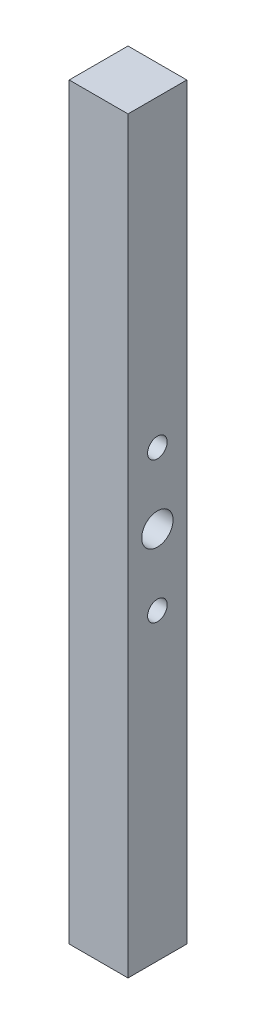
ISO-10303-21;
HEADER;
FILE_DESCRIPTION(('STEP AP214'),'2;1');
FILE_NAME('part.step','',(''),(''),'','','');
FILE_SCHEMA(('AUTOMOTIVE_DESIGN { 1 0 10303 214 1 1 1 1 }'));
ENDSEC;
DATA;
#1=APPLICATION_CONTEXT('core data for automotive mechanical design processes');
#2=APPLICATION_PROTOCOL_DEFINITION('international standard','automotive_design',2000,#1);
#3=PRODUCT_CONTEXT('',#1,'mechanical');
#4=PRODUCT('Part','Part','',(#3));
#5=PRODUCT_RELATED_PRODUCT_CATEGORY('part','',(#4));
#6=PRODUCT_DEFINITION_FORMATION('','',#4);
#7=PRODUCT_DEFINITION_CONTEXT('part definition',#1,'design');
#8=PRODUCT_DEFINITION('design','',#6,#7);
#9=PRODUCT_DEFINITION_SHAPE('','',#8);
#10=(LENGTH_UNIT() NAMED_UNIT(*) SI_UNIT(.MILLI.,.METRE.));
#11=(NAMED_UNIT(*) PLANE_ANGLE_UNIT() SI_UNIT($,.RADIAN.));
#12=(NAMED_UNIT(*) SI_UNIT($,.STERADIAN.) SOLID_ANGLE_UNIT());
#13=UNCERTAINTY_MEASURE_WITH_UNIT(LENGTH_MEASURE(1.E-05),#10,'distance_accuracy_value','');
#14=(GEOMETRIC_REPRESENTATION_CONTEXT(3) GLOBAL_UNCERTAINTY_ASSIGNED_CONTEXT((#13)) GLOBAL_UNIT_ASSIGNED_CONTEXT((#10,
#11,#12)) REPRESENTATION_CONTEXT('',''));
#15=CARTESIAN_POINT('',(0.,0.,0.));
#16=DIRECTION('',(0.,0.,1.));
#17=DIRECTION('',(1.,0.,0.));
#18=AXIS2_PLACEMENT_3D('',#15,#16,#17);
#19=CARTESIAN_POINT('',(7.5,190.88,-7.5));
#20=DIRECTION('',(-1.,0.,0.));
#21=DIRECTION('',(0.,0.,1.));
#22=AXIS2_PLACEMENT_3D('',#19,#20,#21);
#23=PLANE('',#22);
#24=CARTESIAN_POINT('',(7.5,77.44,0.));
#25=DIRECTION('',(1.,0.,0.));
#26=DIRECTION('',(0.,0.,-1.));
#27=AXIS2_PLACEMENT_3D('',#24,#25,#26);
#28=CIRCLE('',#27,2.5);
#29=CARTESIAN_POINT('',(7.5,77.44,-2.49999999999999));
#30=VERTEX_POINT('',#29);
#31=EDGE_CURVE('E136',#30,#30,#28,.T.);
#32=ORIENTED_EDGE('',*,*,#31,.F.);
#33=EDGE_LOOP('',(#32));
#34=FACE_BOUND('',#33,.T.);
#35=CARTESIAN_POINT('',(7.5,113.44,0.));
#36=DIRECTION('',(1.,0.,0.));
#37=DIRECTION('',(0.,0.,-1.));
#38=AXIS2_PLACEMENT_3D('',#35,#36,#37);
#39=CIRCLE('',#38,2.5);
#40=CARTESIAN_POINT('',(7.5,113.44,-2.49999999999999));
#41=VERTEX_POINT('',#40);
#42=EDGE_CURVE('E144',#41,#41,#39,.T.);
#43=ORIENTED_EDGE('',*,*,#42,.F.);
#44=EDGE_LOOP('',(#43));
#45=FACE_BOUND('',#44,.T.);
#46=CARTESIAN_POINT('',(7.5,95.44,0.));
#47=DIRECTION('',(1.,0.,0.));
#48=DIRECTION('',(0.,0.,-1.));
#49=AXIS2_PLACEMENT_3D('',#46,#47,#48);
#50=CIRCLE('',#49,4.00000000000001);
#51=CARTESIAN_POINT('',(7.5,95.44,-3.99999999999999));
#52=VERTEX_POINT('',#51);
#53=EDGE_CURVE('E128',#52,#52,#50,.T.);
#54=ORIENTED_EDGE('',*,*,#53,.F.);
#55=EDGE_LOOP('',(#54));
#56=FACE_BOUND('',#55,.T.);
#57=DIRECTION('',(0.,0.,-1.));
#58=VECTOR('',#57,1.);
#59=CARTESIAN_POINT('',(7.5,0.,-7.5));
#60=LINE('',#59,#58);
#61=CARTESIAN_POINT('',(7.5,0.,7.5));
#62=VERTEX_POINT('',#61);
#63=CARTESIAN_POINT('',(7.5,0.,-7.5));
#64=VERTEX_POINT('',#63);
#65=EDGE_CURVE('E107',#62,#64,#60,.T.);
#66=ORIENTED_EDGE('',*,*,#65,.T.);
#67=DIRECTION('',(0.,-1.,0.));
#68=VECTOR('',#67,1.);
#69=CARTESIAN_POINT('',(7.5,190.88,-7.5));
#70=LINE('',#69,#68);
#71=CARTESIAN_POINT('',(7.5,190.88,-7.5));
#72=VERTEX_POINT('',#71);
#73=EDGE_CURVE('E11',#72,#64,#70,.T.);
#74=ORIENTED_EDGE('',*,*,#73,.F.);
#75=DIRECTION('',(0.,0.,-1.));
#76=VECTOR('',#75,1.);
#77=CARTESIAN_POINT('',(7.5,190.88,-7.5));
#78=LINE('',#77,#76);
#79=CARTESIAN_POINT('',(7.5,190.88,7.5));
#80=VERTEX_POINT('',#79);
#81=EDGE_CURVE('E91',#80,#72,#78,.T.);
#82=ORIENTED_EDGE('',*,*,#81,.F.);
#83=DIRECTION('',(0.,-1.,0.));
#84=VECTOR('',#83,1.);
#85=CARTESIAN_POINT('',(7.5,190.88,7.5));
#86=LINE('',#85,#84);
#87=EDGE_CURVE('E103',#80,#62,#86,.T.);
#88=ORIENTED_EDGE('',*,*,#87,.T.);
#89=EDGE_LOOP('',(#66,#74,#82,#88));
#90=FACE_BOUND('',#89,.T.);
#91=ADVANCED_FACE('F39',(#34,#45,#56,#90),#23,.F.);
#92=CARTESIAN_POINT('',(-7.5,190.88,-7.5));
#93=DIRECTION('',(0.,0.,1.));
#94=DIRECTION('',(1.,0.,0.));
#95=AXIS2_PLACEMENT_3D('',#92,#93,#94);
#96=PLANE('',#95);
#97=DIRECTION('',(-1.,0.,0.));
#98=VECTOR('',#97,1.);
#99=CARTESIAN_POINT('',(-7.5,0.,-7.5));
#100=LINE('',#99,#98);
#101=CARTESIAN_POINT('',(-7.5,0.,-7.5));
#102=VERTEX_POINT('',#101);
#103=EDGE_CURVE('E96',#64,#102,#100,.T.);
#104=ORIENTED_EDGE('',*,*,#103,.T.);
#105=DIRECTION('',(0.,-1.,0.));
#106=VECTOR('',#105,1.);
#107=CARTESIAN_POINT('',(-7.5,190.88,-7.5));
#108=LINE('',#107,#106);
#109=CARTESIAN_POINT('',(-7.5,190.88,-7.5));
#110=VERTEX_POINT('',#109);
#111=EDGE_CURVE('E48',#110,#102,#108,.T.);
#112=ORIENTED_EDGE('',*,*,#111,.F.);
#113=DIRECTION('',(-1.,0.,0.));
#114=VECTOR('',#113,1.);
#115=CARTESIAN_POINT('',(-7.5,190.88,-7.5));
#116=LINE('',#115,#114);
#117=EDGE_CURVE('E86',#72,#110,#116,.T.);
#118=ORIENTED_EDGE('',*,*,#117,.F.);
#119=ORIENTED_EDGE('',*,*,#73,.T.);
#120=EDGE_LOOP('',(#104,#112,#118,#119));
#121=FACE_BOUND('',#120,.T.);
#122=ADVANCED_FACE('F95',(#121),#96,.F.);
#123=CARTESIAN_POINT('',(-7.5,190.88,-7.5));
#124=DIRECTION('',(1.,0.,0.));
#125=DIRECTION('',(0.,0.,-1.));
#126=AXIS2_PLACEMENT_3D('',#123,#124,#125);
#127=PLANE('',#126);
#128=CARTESIAN_POINT('',(-7.5,77.44,0.));
#129=DIRECTION('',(1.,0.,0.));
#130=DIRECTION('',(0.,0.,-1.));
#131=AXIS2_PLACEMENT_3D('',#128,#129,#130);
#132=CIRCLE('',#131,2.5);
#133=CARTESIAN_POINT('',(-7.5,77.44,-2.49999999999999));
#134=VERTEX_POINT('',#133);
#135=EDGE_CURVE('E140',#134,#134,#132,.T.);
#136=ORIENTED_EDGE('',*,*,#135,.T.);
#137=EDGE_LOOP('',(#136));
#138=FACE_BOUND('',#137,.T.);
#139=CARTESIAN_POINT('',(-7.5,113.44,0.));
#140=DIRECTION('',(1.,0.,0.));
#141=DIRECTION('',(0.,0.,-1.));
#142=AXIS2_PLACEMENT_3D('',#139,#140,#141);
#143=CIRCLE('',#142,2.5);
#144=CARTESIAN_POINT('',(-7.5,113.44,-2.49999999999999));
#145=VERTEX_POINT('',#144);
#146=EDGE_CURVE('E132',#145,#145,#143,.T.);
#147=ORIENTED_EDGE('',*,*,#146,.T.);
#148=EDGE_LOOP('',(#147));
#149=FACE_BOUND('',#148,.T.);
#150=CARTESIAN_POINT('',(-7.5,95.44,0.));
#151=DIRECTION('',(1.,0.,0.));
#152=DIRECTION('',(0.,0.,-1.));
#153=AXIS2_PLACEMENT_3D('',#150,#151,#152);
#154=CIRCLE('',#153,4.00000000000001);
#155=CARTESIAN_POINT('',(-7.5,95.44,-3.99999999999999));
#156=VERTEX_POINT('',#155);
#157=EDGE_CURVE('E111',#156,#156,#154,.T.);
#158=ORIENTED_EDGE('',*,*,#157,.T.);
#159=EDGE_LOOP('',(#158));
#160=FACE_BOUND('',#159,.T.);
#161=DIRECTION('',(0.,0.,1.));
#162=VECTOR('',#161,1.);
#163=CARTESIAN_POINT('',(-7.5,0.,-7.5));
#164=LINE('',#163,#162);
#165=CARTESIAN_POINT('',(-7.5,0.,7.5));
#166=VERTEX_POINT('',#165);
#167=EDGE_CURVE('E73',#102,#166,#164,.T.);
#168=ORIENTED_EDGE('',*,*,#167,.T.);
#169=DIRECTION('',(0.,-1.,0.));
#170=VECTOR('',#169,1.);
#171=CARTESIAN_POINT('',(-7.5,190.88,7.5));
#172=LINE('',#171,#170);
#173=CARTESIAN_POINT('',(-7.5,190.88,7.5));
#174=VERTEX_POINT('',#173);
#175=EDGE_CURVE('E98',#174,#166,#172,.T.);
#176=ORIENTED_EDGE('',*,*,#175,.F.);
#177=DIRECTION('',(0.,0.,1.));
#178=VECTOR('',#177,1.);
#179=CARTESIAN_POINT('',(-7.5,190.88,-7.5));
#180=LINE('',#179,#178);
#181=EDGE_CURVE('E89',#110,#174,#180,.T.);
#182=ORIENTED_EDGE('',*,*,#181,.F.);
#183=ORIENTED_EDGE('',*,*,#111,.T.);
#184=EDGE_LOOP('',(#168,#176,#182,#183));
#185=FACE_BOUND('',#184,.T.);
#186=ADVANCED_FACE('F99',(#138,#149,#160,#185),#127,.F.);
#187=CARTESIAN_POINT('',(-7.5,190.88,7.5));
#188=DIRECTION('',(0.,0.,-1.));
#189=DIRECTION('',(-1.,0.,0.));
#190=AXIS2_PLACEMENT_3D('',#187,#188,#189);
#191=PLANE('',#190);
#192=DIRECTION('',(1.,0.,0.));
#193=VECTOR('',#192,1.);
#194=CARTESIAN_POINT('',(-7.5,0.,7.5));
#195=LINE('',#194,#193);
#196=EDGE_CURVE('E79',#166,#62,#195,.T.);
#197=ORIENTED_EDGE('',*,*,#196,.T.);
#198=ORIENTED_EDGE('',*,*,#87,.F.);
#199=DIRECTION('',(1.,0.,0.));
#200=VECTOR('',#199,1.);
#201=CARTESIAN_POINT('',(-7.5,190.88,7.5));
#202=LINE('',#201,#200);
#203=EDGE_CURVE('E56',#174,#80,#202,.T.);
#204=ORIENTED_EDGE('',*,*,#203,.F.);
#205=ORIENTED_EDGE('',*,*,#175,.T.);
#206=EDGE_LOOP('',(#197,#198,#204,#205));
#207=FACE_BOUND('',#206,.T.);
#208=ADVANCED_FACE('F121',(#207),#191,.F.);
#209=CARTESIAN_POINT('',(0.,190.88,0.));
#210=DIRECTION('',(0.,1.,0.));
#211=DIRECTION('',(0.,0.,1.));
#212=AXIS2_PLACEMENT_3D('',#209,#210,#211);
#213=PLANE('',#212);
#214=ORIENTED_EDGE('',*,*,#81,.T.);
#215=ORIENTED_EDGE('',*,*,#117,.T.);
#216=ORIENTED_EDGE('',*,*,#181,.T.);
#217=ORIENTED_EDGE('',*,*,#203,.T.);
#218=EDGE_LOOP('',(#214,#215,#216,#217));
#219=FACE_BOUND('',#218,.T.);
#220=ADVANCED_FACE('F87',(#219),#213,.T.);
#221=CARTESIAN_POINT('',(0.,0.,0.));
#222=DIRECTION('',(0.,1.,0.));
#223=DIRECTION('',(0.,0.,1.));
#224=AXIS2_PLACEMENT_3D('',#221,#222,#223);
#225=PLANE('',#224);
#226=ORIENTED_EDGE('',*,*,#65,.F.);
#227=ORIENTED_EDGE('',*,*,#196,.F.);
#228=ORIENTED_EDGE('',*,*,#167,.F.);
#229=ORIENTED_EDGE('',*,*,#103,.F.);
#230=EDGE_LOOP('',(#226,#227,#228,#229));
#231=FACE_BOUND('',#230,.T.);
#232=ADVANCED_FACE('F124',(#231),#225,.F.);
#233=CARTESIAN_POINT('',(-7.5,95.44,0.));
#234=DIRECTION('',(1.,0.,0.));
#235=DIRECTION('',(0.,0.,-1.));
#236=AXIS2_PLACEMENT_3D('',#233,#234,#235);
#237=CYLINDRICAL_SURFACE('',#236,4.00000000000001);
#238=CARTESIAN_POINT('',(-7.5,95.44,-3.99999999999999));
#239=CARTESIAN_POINT('',(-7.34375,95.44,-3.99999999999999));
#240=CARTESIAN_POINT('',(-7.1875,95.44,-3.99999999999999));
#241=CARTESIAN_POINT('',(-6.875,95.44,-3.99999999999999));
#242=CARTESIAN_POINT('',(-6.71875,95.44,-3.99999999999999));
#243=CARTESIAN_POINT('',(-6.40625,95.44,-3.99999999999999));
#244=CARTESIAN_POINT('',(-6.25,95.44,-3.99999999999999));
#245=CARTESIAN_POINT('',(-5.9375,95.44,-3.99999999999999));
#246=CARTESIAN_POINT('',(-5.78125,95.44,-3.99999999999999));
#247=CARTESIAN_POINT('',(-5.46875,95.44,-3.99999999999999));
#248=CARTESIAN_POINT('',(-5.3125,95.44,-3.99999999999999));
#249=CARTESIAN_POINT('',(-5.,95.44,-3.99999999999999));
#250=CARTESIAN_POINT('',(-4.84375,95.44,-3.99999999999999));
#251=CARTESIAN_POINT('',(-4.53125,95.44,-3.99999999999999));
#252=CARTESIAN_POINT('',(-4.375,95.44,-3.99999999999999));
#253=CARTESIAN_POINT('',(-4.0625,95.44,-3.99999999999999));
#254=CARTESIAN_POINT('',(-3.90625,95.44,-3.99999999999999));
#255=CARTESIAN_POINT('',(-3.59375,95.44,-3.99999999999999));
#256=CARTESIAN_POINT('',(-3.4375,95.44,-3.99999999999999));
#257=CARTESIAN_POINT('',(-3.125,95.44,-3.99999999999999));
#258=CARTESIAN_POINT('',(-2.96875,95.44,-3.99999999999999));
#259=CARTESIAN_POINT('',(-2.65625,95.44,-3.99999999999999));
#260=CARTESIAN_POINT('',(-2.5,95.44,-3.99999999999999));
#261=CARTESIAN_POINT('',(-2.1875,95.44,-3.99999999999999));
#262=CARTESIAN_POINT('',(-2.03125,95.44,-3.99999999999999));
#263=CARTESIAN_POINT('',(-1.71875,95.44,-3.99999999999999));
#264=CARTESIAN_POINT('',(-1.5625,95.44,-3.99999999999999));
#265=CARTESIAN_POINT('',(-1.25,95.44,-3.99999999999999));
#266=CARTESIAN_POINT('',(-1.09375,95.44,-3.99999999999999));
#267=CARTESIAN_POINT('',(-0.781250000000001,95.44,-3.99999999999999));
#268=CARTESIAN_POINT('',(-0.625000000000001,95.44,-3.99999999999999));
#269=CARTESIAN_POINT('',(-0.312500000000001,95.44,-3.99999999999999));
#270=CARTESIAN_POINT('',(-0.156250000000001,95.44,-3.99999999999999));
#271=CARTESIAN_POINT('',(0.156249999999999,95.44,-3.99999999999999));
#272=CARTESIAN_POINT('',(0.312499999999999,95.44,-3.99999999999999));
#273=CARTESIAN_POINT('',(0.624999999999999,95.44,-3.99999999999999));
#274=CARTESIAN_POINT('',(0.781249999999999,95.44,-3.99999999999999));
#275=CARTESIAN_POINT('',(1.09375,95.44,-3.99999999999999));
#276=CARTESIAN_POINT('',(1.25,95.44,-3.99999999999999));
#277=CARTESIAN_POINT('',(1.5625,95.44,-3.99999999999999));
#278=CARTESIAN_POINT('',(1.71875,95.44,-3.99999999999999));
#279=CARTESIAN_POINT('',(2.03125,95.44,-3.99999999999999));
#280=CARTESIAN_POINT('',(2.1875,95.44,-3.99999999999999));
#281=CARTESIAN_POINT('',(2.5,95.44,-3.99999999999999));
#282=CARTESIAN_POINT('',(2.65625,95.44,-3.99999999999999));
#283=CARTESIAN_POINT('',(2.96875,95.44,-3.99999999999999));
#284=CARTESIAN_POINT('',(3.125,95.44,-3.99999999999999));
#285=CARTESIAN_POINT('',(3.4375,95.44,-3.99999999999999));
#286=CARTESIAN_POINT('',(3.59375,95.44,-3.99999999999999));
#287=CARTESIAN_POINT('',(3.90625,95.44,-3.99999999999999));
#288=CARTESIAN_POINT('',(4.0625,95.44,-3.99999999999999));
#289=CARTESIAN_POINT('',(4.375,95.44,-3.99999999999999));
#290=CARTESIAN_POINT('',(4.53125,95.44,-3.99999999999999));
#291=CARTESIAN_POINT('',(4.84375,95.44,-3.99999999999999));
#292=CARTESIAN_POINT('',(5.,95.44,-3.99999999999999));
#293=CARTESIAN_POINT('',(5.3125,95.44,-3.99999999999999));
#294=CARTESIAN_POINT('',(5.46875,95.44,-3.99999999999999));
#295=CARTESIAN_POINT('',(5.78125,95.44,-3.99999999999999));
#296=CARTESIAN_POINT('',(5.9375,95.44,-3.99999999999999));
#297=CARTESIAN_POINT('',(6.25,95.44,-3.99999999999999));
#298=CARTESIAN_POINT('',(6.40625,95.44,-3.99999999999999));
#299=CARTESIAN_POINT('',(6.71875,95.44,-3.99999999999999));
#300=CARTESIAN_POINT('',(6.875,95.44,-3.99999999999999));
#301=CARTESIAN_POINT('',(7.1875,95.44,-3.99999999999999));
#302=CARTESIAN_POINT('',(7.34375,95.44,-3.99999999999999));
#303=CARTESIAN_POINT('',(7.5,95.44,-3.99999999999999));
#304=B_SPLINE_CURVE_WITH_KNOTS('',3,(#238,#239,#240,#241,#242,#243,#244,#245,#246,#247,#248,
#249,#250,#251,#252,#253,#254,#255,#256,#257,#258,#259,#260,#261,#262,#263,#264,#265,#266,#267,
#268,#269,#270,#271,#272,#273,#274,#275,#276,#277,#278,#279,#280,#281,#282,#283,#284,#285,#286,
#287,#288,#289,#290,#291,#292,#293,#294,#295,#296,#297,#298,#299,#300,#301,#302,#303),
.UNSPECIFIED.,.F.,.F.,(4,2,2,2,2,2,2,2,2,2,2,2,2,2,2,2,2,2,2,2,2,2,2,2,2,2,2,2,2,2,2,2,4),(0.,
0.46875,0.937500000000001,1.40625,1.875,2.34375,2.8125,3.28125,3.75,4.21875,4.6875,5.15625,
5.625,6.09375,6.5625,7.03125,7.5,7.96875,8.4375,8.90625,9.375,9.84375,10.3125,10.78125,11.25,
11.71875,12.1875,12.65625,13.125,13.59375,14.0625,14.53125,15.),.UNSPECIFIED.);
#305=EDGE_CURVE('BSEAM158',#156,#52,#304,.T.);
#306=ORIENTED_EDGE('',*,*,#157,.F.);
#307=ORIENTED_EDGE('',*,*,#53,.T.);
#308=ORIENTED_EDGE('',*,*,#305,.T.);
#309=ORIENTED_EDGE('',*,*,#305,.F.);
#310=EDGE_LOOP('',(#306,#308,#307,#309));
#311=FACE_BOUND('',#310,.T.);
#312=ADVANCED_FACE('F158',(#311),#237,.F.);
#313=CARTESIAN_POINT('',(-7.5,113.44,0.));
#314=DIRECTION('',(1.,0.,0.));
#315=DIRECTION('',(0.,0.,-1.));
#316=AXIS2_PLACEMENT_3D('',#313,#314,#315);
#317=CYLINDRICAL_SURFACE('',#316,2.5);
#318=CARTESIAN_POINT('',(-7.5,113.44,-2.49999999999999));
#319=CARTESIAN_POINT('',(-7.34375,113.44,-2.49999999999999));
#320=CARTESIAN_POINT('',(-7.1875,113.44,-2.49999999999999));
#321=CARTESIAN_POINT('',(-6.875,113.44,-2.49999999999999));
#322=CARTESIAN_POINT('',(-6.71875,113.44,-2.49999999999999));
#323=CARTESIAN_POINT('',(-6.40625,113.44,-2.49999999999999));
#324=CARTESIAN_POINT('',(-6.25,113.44,-2.49999999999999));
#325=CARTESIAN_POINT('',(-5.9375,113.44,-2.49999999999999));
#326=CARTESIAN_POINT('',(-5.78125,113.44,-2.49999999999999));
#327=CARTESIAN_POINT('',(-5.46875,113.44,-2.49999999999999));
#328=CARTESIAN_POINT('',(-5.3125,113.44,-2.49999999999999));
#329=CARTESIAN_POINT('',(-5.,113.44,-2.49999999999999));
#330=CARTESIAN_POINT('',(-4.84375,113.44,-2.49999999999999));
#331=CARTESIAN_POINT('',(-4.53125,113.44,-2.49999999999999));
#332=CARTESIAN_POINT('',(-4.375,113.44,-2.49999999999999));
#333=CARTESIAN_POINT('',(-4.0625,113.44,-2.49999999999999));
#334=CARTESIAN_POINT('',(-3.90625,113.44,-2.49999999999999));
#335=CARTESIAN_POINT('',(-3.59375,113.44,-2.49999999999999));
#336=CARTESIAN_POINT('',(-3.4375,113.44,-2.49999999999999));
#337=CARTESIAN_POINT('',(-3.125,113.44,-2.49999999999999));
#338=CARTESIAN_POINT('',(-2.96875,113.44,-2.49999999999999));
#339=CARTESIAN_POINT('',(-2.65625,113.44,-2.49999999999999));
#340=CARTESIAN_POINT('',(-2.5,113.44,-2.49999999999999));
#341=CARTESIAN_POINT('',(-2.1875,113.44,-2.49999999999999));
#342=CARTESIAN_POINT('',(-2.03125,113.44,-2.49999999999999));
#343=CARTESIAN_POINT('',(-1.71875,113.44,-2.49999999999999));
#344=CARTESIAN_POINT('',(-1.5625,113.44,-2.49999999999999));
#345=CARTESIAN_POINT('',(-1.25,113.44,-2.49999999999999));
#346=CARTESIAN_POINT('',(-1.09375,113.44,-2.49999999999999));
#347=CARTESIAN_POINT('',(-0.781250000000001,113.44,-2.49999999999999));
#348=CARTESIAN_POINT('',(-0.625000000000001,113.44,-2.49999999999999));
#349=CARTESIAN_POINT('',(-0.312500000000001,113.44,-2.49999999999999));
#350=CARTESIAN_POINT('',(-0.156250000000001,113.44,-2.49999999999999));
#351=CARTESIAN_POINT('',(0.156249999999999,113.44,-2.49999999999999));
#352=CARTESIAN_POINT('',(0.312499999999999,113.44,-2.49999999999999));
#353=CARTESIAN_POINT('',(0.625,113.44,-2.49999999999999));
#354=CARTESIAN_POINT('',(0.78125,113.44,-2.49999999999999));
#355=CARTESIAN_POINT('',(1.09375,113.44,-2.49999999999999));
#356=CARTESIAN_POINT('',(1.25,113.44,-2.49999999999999));
#357=CARTESIAN_POINT('',(1.5625,113.44,-2.49999999999999));
#358=CARTESIAN_POINT('',(1.71875,113.44,-2.49999999999999));
#359=CARTESIAN_POINT('',(2.03125,113.44,-2.49999999999999));
#360=CARTESIAN_POINT('',(2.1875,113.44,-2.49999999999999));
#361=CARTESIAN_POINT('',(2.5,113.44,-2.49999999999999));
#362=CARTESIAN_POINT('',(2.65625,113.44,-2.49999999999999));
#363=CARTESIAN_POINT('',(2.96875,113.44,-2.49999999999999));
#364=CARTESIAN_POINT('',(3.125,113.44,-2.49999999999999));
#365=CARTESIAN_POINT('',(3.4375,113.44,-2.49999999999999));
#366=CARTESIAN_POINT('',(3.59375,113.44,-2.49999999999999));
#367=CARTESIAN_POINT('',(3.90625,113.44,-2.49999999999999));
#368=CARTESIAN_POINT('',(4.0625,113.44,-2.49999999999999));
#369=CARTESIAN_POINT('',(4.375,113.44,-2.49999999999999));
#370=CARTESIAN_POINT('',(4.53125,113.44,-2.49999999999999));
#371=CARTESIAN_POINT('',(4.84375,113.44,-2.49999999999999));
#372=CARTESIAN_POINT('',(5.,113.44,-2.49999999999999));
#373=CARTESIAN_POINT('',(5.3125,113.44,-2.49999999999999));
#374=CARTESIAN_POINT('',(5.46875,113.44,-2.49999999999999));
#375=CARTESIAN_POINT('',(5.78125,113.44,-2.49999999999999));
#376=CARTESIAN_POINT('',(5.9375,113.44,-2.49999999999999));
#377=CARTESIAN_POINT('',(6.25,113.44,-2.49999999999999));
#378=CARTESIAN_POINT('',(6.40625,113.44,-2.49999999999999));
#379=CARTESIAN_POINT('',(6.71875,113.44,-2.49999999999999));
#380=CARTESIAN_POINT('',(6.875,113.44,-2.49999999999999));
#381=CARTESIAN_POINT('',(7.1875,113.44,-2.49999999999999));
#382=CARTESIAN_POINT('',(7.34375,113.44,-2.49999999999999));
#383=CARTESIAN_POINT('',(7.5,113.44,-2.49999999999999));
#384=B_SPLINE_CURVE_WITH_KNOTS('',3,(#318,#319,#320,#321,#322,#323,#324,#325,#326,#327,#328,
#329,#330,#331,#332,#333,#334,#335,#336,#337,#338,#339,#340,#341,#342,#343,#344,#345,#346,#347,
#348,#349,#350,#351,#352,#353,#354,#355,#356,#357,#358,#359,#360,#361,#362,#363,#364,#365,#366,
#367,#368,#369,#370,#371,#372,#373,#374,#375,#376,#377,#378,#379,#380,#381,#382,#383),
.UNSPECIFIED.,.F.,.F.,(4,2,2,2,2,2,2,2,2,2,2,2,2,2,2,2,2,2,2,2,2,2,2,2,2,2,2,2,2,2,2,2,4),(0.,
0.46875,0.937500000000001,1.40625,1.875,2.34375,2.8125,3.28125,3.75,4.21875,4.6875,5.15625,
5.625,6.09375,6.5625,7.03125,7.5,7.96875,8.4375,8.90625,9.375,9.84375,10.3125,10.78125,11.25,
11.71875,12.1875,12.65625,13.125,13.59375,14.0625,14.53125,15.),.UNSPECIFIED.);
#385=EDGE_CURVE('BSEAM154',#145,#41,#384,.T.);
#386=ORIENTED_EDGE('',*,*,#146,.F.);
#387=ORIENTED_EDGE('',*,*,#42,.T.);
#388=ORIENTED_EDGE('',*,*,#385,.T.);
#389=ORIENTED_EDGE('',*,*,#385,.F.);
#390=EDGE_LOOP('',(#386,#388,#387,#389));
#391=FACE_BOUND('',#390,.T.);
#392=ADVANCED_FACE('F154',(#391),#317,.F.);
#393=CARTESIAN_POINT('',(-7.5,77.44,0.));
#394=DIRECTION('',(1.,0.,0.));
#395=DIRECTION('',(0.,0.,-1.));
#396=AXIS2_PLACEMENT_3D('',#393,#394,#395);
#397=CYLINDRICAL_SURFACE('',#396,2.5);
#398=CARTESIAN_POINT('',(-7.5,77.44,-2.49999999999999));
#399=CARTESIAN_POINT('',(-7.34375,77.44,-2.49999999999999));
#400=CARTESIAN_POINT('',(-7.1875,77.44,-2.49999999999999));
#401=CARTESIAN_POINT('',(-6.875,77.44,-2.49999999999999));
#402=CARTESIAN_POINT('',(-6.71875,77.44,-2.49999999999999));
#403=CARTESIAN_POINT('',(-6.40625,77.44,-2.49999999999999));
#404=CARTESIAN_POINT('',(-6.25,77.44,-2.49999999999999));
#405=CARTESIAN_POINT('',(-5.9375,77.44,-2.49999999999999));
#406=CARTESIAN_POINT('',(-5.78125,77.44,-2.49999999999999));
#407=CARTESIAN_POINT('',(-5.46875,77.44,-2.49999999999999));
#408=CARTESIAN_POINT('',(-5.3125,77.44,-2.49999999999999));
#409=CARTESIAN_POINT('',(-5.,77.44,-2.49999999999999));
#410=CARTESIAN_POINT('',(-4.84375,77.44,-2.49999999999999));
#411=CARTESIAN_POINT('',(-4.53125,77.44,-2.49999999999999));
#412=CARTESIAN_POINT('',(-4.375,77.44,-2.49999999999999));
#413=CARTESIAN_POINT('',(-4.0625,77.44,-2.49999999999999));
#414=CARTESIAN_POINT('',(-3.90625,77.44,-2.49999999999999));
#415=CARTESIAN_POINT('',(-3.59375,77.44,-2.49999999999999));
#416=CARTESIAN_POINT('',(-3.4375,77.44,-2.49999999999999));
#417=CARTESIAN_POINT('',(-3.125,77.44,-2.49999999999999));
#418=CARTESIAN_POINT('',(-2.96875,77.44,-2.49999999999999));
#419=CARTESIAN_POINT('',(-2.65625,77.44,-2.49999999999999));
#420=CARTESIAN_POINT('',(-2.5,77.44,-2.49999999999999));
#421=CARTESIAN_POINT('',(-2.1875,77.44,-2.49999999999999));
#422=CARTESIAN_POINT('',(-2.03125,77.44,-2.49999999999999));
#423=CARTESIAN_POINT('',(-1.71875,77.44,-2.49999999999999));
#424=CARTESIAN_POINT('',(-1.5625,77.44,-2.49999999999999));
#425=CARTESIAN_POINT('',(-1.25,77.44,-2.49999999999999));
#426=CARTESIAN_POINT('',(-1.09375,77.44,-2.49999999999999));
#427=CARTESIAN_POINT('',(-0.781250000000001,77.44,-2.49999999999999));
#428=CARTESIAN_POINT('',(-0.625000000000001,77.44,-2.49999999999999));
#429=CARTESIAN_POINT('',(-0.312500000000001,77.44,-2.49999999999999));
#430=CARTESIAN_POINT('',(-0.156250000000001,77.44,-2.49999999999999));
#431=CARTESIAN_POINT('',(0.156249999999999,77.44,-2.49999999999999));
#432=CARTESIAN_POINT('',(0.312499999999999,77.44,-2.49999999999999));
#433=CARTESIAN_POINT('',(0.625,77.44,-2.49999999999999));
#434=CARTESIAN_POINT('',(0.78125,77.44,-2.49999999999999));
#435=CARTESIAN_POINT('',(1.09375,77.44,-2.49999999999999));
#436=CARTESIAN_POINT('',(1.25,77.44,-2.49999999999999));
#437=CARTESIAN_POINT('',(1.5625,77.44,-2.49999999999999));
#438=CARTESIAN_POINT('',(1.71875,77.44,-2.49999999999999));
#439=CARTESIAN_POINT('',(2.03125,77.44,-2.49999999999999));
#440=CARTESIAN_POINT('',(2.1875,77.44,-2.49999999999999));
#441=CARTESIAN_POINT('',(2.5,77.44,-2.49999999999999));
#442=CARTESIAN_POINT('',(2.65625,77.44,-2.49999999999999));
#443=CARTESIAN_POINT('',(2.96875,77.44,-2.49999999999999));
#444=CARTESIAN_POINT('',(3.125,77.44,-2.49999999999999));
#445=CARTESIAN_POINT('',(3.4375,77.44,-2.49999999999999));
#446=CARTESIAN_POINT('',(3.59375,77.44,-2.49999999999999));
#447=CARTESIAN_POINT('',(3.90625,77.44,-2.49999999999999));
#448=CARTESIAN_POINT('',(4.0625,77.44,-2.49999999999999));
#449=CARTESIAN_POINT('',(4.375,77.44,-2.49999999999999));
#450=CARTESIAN_POINT('',(4.53125,77.44,-2.49999999999999));
#451=CARTESIAN_POINT('',(4.84375,77.44,-2.49999999999999));
#452=CARTESIAN_POINT('',(5.,77.44,-2.49999999999999));
#453=CARTESIAN_POINT('',(5.3125,77.44,-2.49999999999999));
#454=CARTESIAN_POINT('',(5.46875,77.44,-2.49999999999999));
#455=CARTESIAN_POINT('',(5.78125,77.44,-2.49999999999999));
#456=CARTESIAN_POINT('',(5.9375,77.44,-2.49999999999999));
#457=CARTESIAN_POINT('',(6.25,77.44,-2.49999999999999));
#458=CARTESIAN_POINT('',(6.40625,77.44,-2.49999999999999));
#459=CARTESIAN_POINT('',(6.71875,77.44,-2.49999999999999));
#460=CARTESIAN_POINT('',(6.875,77.44,-2.49999999999999));
#461=CARTESIAN_POINT('',(7.1875,77.44,-2.49999999999999));
#462=CARTESIAN_POINT('',(7.34375,77.44,-2.49999999999999));
#463=CARTESIAN_POINT('',(7.5,77.44,-2.49999999999999));
#464=B_SPLINE_CURVE_WITH_KNOTS('',3,(#398,#399,#400,#401,#402,#403,#404,#405,#406,#407,#408,
#409,#410,#411,#412,#413,#414,#415,#416,#417,#418,#419,#420,#421,#422,#423,#424,#425,#426,#427,
#428,#429,#430,#431,#432,#433,#434,#435,#436,#437,#438,#439,#440,#441,#442,#443,#444,#445,#446,
#447,#448,#449,#450,#451,#452,#453,#454,#455,#456,#457,#458,#459,#460,#461,#462,#463),
.UNSPECIFIED.,.F.,.F.,(4,2,2,2,2,2,2,2,2,2,2,2,2,2,2,2,2,2,2,2,2,2,2,2,2,2,2,2,2,2,2,2,4),(0.,
0.46875,0.937500000000001,1.40625,1.875,2.34375,2.8125,3.28125,3.75,4.21875,4.6875,5.15625,
5.625,6.09375,6.5625,7.03125,7.5,7.96875,8.4375,8.90625,9.375,9.84375,10.3125,10.78125,11.25,
11.71875,12.1875,12.65625,13.125,13.59375,14.0625,14.53125,15.),.UNSPECIFIED.);
#465=EDGE_CURVE('BSEAM157',#134,#30,#464,.T.);
#466=ORIENTED_EDGE('',*,*,#135,.F.);
#467=ORIENTED_EDGE('',*,*,#31,.T.);
#468=ORIENTED_EDGE('',*,*,#465,.T.);
#469=ORIENTED_EDGE('',*,*,#465,.F.);
#470=EDGE_LOOP('',(#466,#468,#467,#469));
#471=FACE_BOUND('',#470,.T.);
#472=ADVANCED_FACE('F157',(#471),#397,.F.);
#473=CLOSED_SHELL('',(#91,#122,#186,#208,#220,#232,#312,#392,#472));
#474=MANIFOLD_SOLID_BREP('B2',#473);
#475=ADVANCED_BREP_SHAPE_REPRESENTATION('',(#18,#474),#14);
#476=SHAPE_DEFINITION_REPRESENTATION(#9,#475);
ENDSEC;
END-ISO-10303-21;
